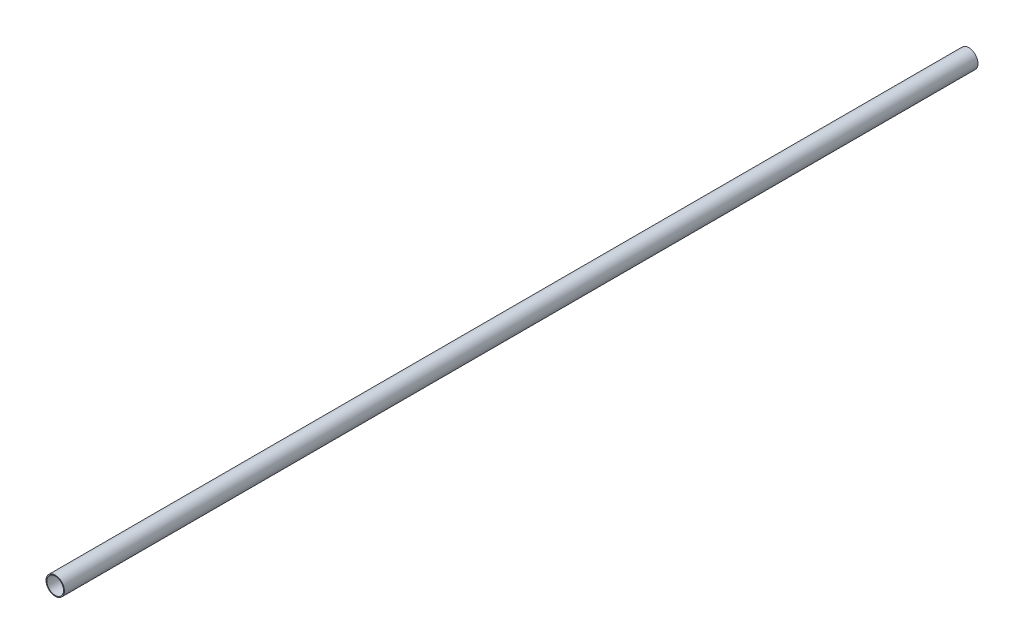
ISO-10303-21;
HEADER;
FILE_DESCRIPTION(('STEP AP214'),'2;1');
FILE_NAME('part.step','',(''),(''),'','','');
FILE_SCHEMA(('AUTOMOTIVE_DESIGN { 1 0 10303 214 1 1 1 1 }'));
ENDSEC;
DATA;
#1=APPLICATION_CONTEXT('core data for automotive mechanical design processes');
#2=APPLICATION_PROTOCOL_DEFINITION('international standard','automotive_design',2000,#1);
#3=PRODUCT_CONTEXT('',#1,'mechanical');
#4=PRODUCT('Part','Part','',(#3));
#5=PRODUCT_RELATED_PRODUCT_CATEGORY('part','',(#4));
#6=PRODUCT_DEFINITION_FORMATION('','',#4);
#7=PRODUCT_DEFINITION_CONTEXT('part definition',#1,'design');
#8=PRODUCT_DEFINITION('design','',#6,#7);
#9=PRODUCT_DEFINITION_SHAPE('','',#8);
#10=(LENGTH_UNIT() NAMED_UNIT(*) SI_UNIT(.MILLI.,.METRE.));
#11=(NAMED_UNIT(*) PLANE_ANGLE_UNIT() SI_UNIT($,.RADIAN.));
#12=(NAMED_UNIT(*) SI_UNIT($,.STERADIAN.) SOLID_ANGLE_UNIT());
#13=UNCERTAINTY_MEASURE_WITH_UNIT(LENGTH_MEASURE(1.E-05),#10,'distance_accuracy_value','');
#14=(GEOMETRIC_REPRESENTATION_CONTEXT(3) GLOBAL_UNCERTAINTY_ASSIGNED_CONTEXT((#13)) GLOBAL_UNIT_ASSIGNED_CONTEXT((#10,
#11,#12)) REPRESENTATION_CONTEXT('',''));
#15=CARTESIAN_POINT('',(0.,0.,0.));
#16=DIRECTION('',(0.,0.,1.));
#17=DIRECTION('',(1.,0.,0.));
#18=AXIS2_PLACEMENT_3D('',#15,#16,#17);
#19=CARTESIAN_POINT('',(0.,0.,1085.85));
#20=DIRECTION('',(0.,0.,1.));
#21=DIRECTION('',(1.,0.,0.));
#22=AXIS2_PLACEMENT_3D('',#19,#20,#21);
#23=PLANE('',#22);
#24=CARTESIAN_POINT('',(0.,0.,1085.85));
#25=DIRECTION('',(0.,0.,1.));
#26=DIRECTION('',(1.,0.,0.));
#27=AXIS2_PLACEMENT_3D('',#24,#25,#26);
#28=CIRCLE('',#27,10.9601);
#29=CARTESIAN_POINT('',(10.9601,0.,1085.85));
#30=VERTEX_POINT('',#29);
#31=EDGE_CURVE('E10',#30,#30,#28,.T.);
#32=ORIENTED_EDGE('',*,*,#31,.T.);
#33=EDGE_LOOP('',(#32));
#34=FACE_BOUND('',#33,.T.);
#35=CARTESIAN_POINT('',(0.,0.,1085.85));
#36=DIRECTION('',(0.,0.,1.));
#37=DIRECTION('',(1.,0.,0.));
#38=AXIS2_PLACEMENT_3D('',#35,#36,#37);
#39=CIRCLE('',#38,9.9441);
#40=CARTESIAN_POINT('',(9.9441,0.,1085.85));
#41=VERTEX_POINT('',#40);
#42=EDGE_CURVE('E48',#41,#41,#39,.T.);
#43=ORIENTED_EDGE('',*,*,#42,.F.);
#44=EDGE_LOOP('',(#43));
#45=FACE_BOUND('',#44,.T.);
#46=ADVANCED_FACE('F37',(#34,#45),#23,.T.);
#47=CARTESIAN_POINT('',(0.,0.,0.));
#48=DIRECTION('',(0.,0.,1.));
#49=DIRECTION('',(1.,0.,0.));
#50=AXIS2_PLACEMENT_3D('',#47,#48,#49);
#51=PLANE('',#50);
#52=CARTESIAN_POINT('',(0.,0.,0.));
#53=DIRECTION('',(0.,0.,1.));
#54=DIRECTION('',(1.,0.,0.));
#55=AXIS2_PLACEMENT_3D('',#52,#53,#54);
#56=CIRCLE('',#55,10.9601);
#57=CARTESIAN_POINT('',(10.9601,0.,0.));
#58=VERTEX_POINT('',#57);
#59=EDGE_CURVE('E41',#58,#58,#56,.T.);
#60=ORIENTED_EDGE('',*,*,#59,.F.);
#61=EDGE_LOOP('',(#60));
#62=FACE_BOUND('',#61,.T.);
#63=CARTESIAN_POINT('',(0.,0.,0.));
#64=DIRECTION('',(0.,0.,1.));
#65=DIRECTION('',(1.,0.,0.));
#66=AXIS2_PLACEMENT_3D('',#63,#64,#65);
#67=CIRCLE('',#66,9.9441);
#68=CARTESIAN_POINT('',(9.9441,0.,0.));
#69=VERTEX_POINT('',#68);
#70=EDGE_CURVE('E50',#69,#69,#67,.T.);
#71=ORIENTED_EDGE('',*,*,#70,.T.);
#72=EDGE_LOOP('',(#71));
#73=FACE_BOUND('',#72,.T.);
#74=ADVANCED_FACE('F60',(#62,#73),#51,.F.);
#75=CARTESIAN_POINT('',(0.,0.,1085.85));
#76=DIRECTION('',(0.,0.,-1.));
#77=DIRECTION('',(-1.,0.,0.));
#78=AXIS2_PLACEMENT_3D('',#75,#76,#77);
#79=CYLINDRICAL_SURFACE('',#78,10.9601);
#80=ORIENTED_EDGE('',*,*,#31,.F.);
#81=EDGE_LOOP('',(#80));
#82=FACE_BOUND('',#81,.T.);
#83=ORIENTED_EDGE('',*,*,#59,.T.);
#84=EDGE_LOOP('',(#83));
#85=FACE_BOUND('',#84,.T.);
#86=ADVANCED_FACE('F39',(#82,#85),#79,.T.);
#87=CARTESIAN_POINT('',(0.,0.,1085.85));
#88=DIRECTION('',(0.,0.,-1.));
#89=DIRECTION('',(-1.,0.,0.));
#90=AXIS2_PLACEMENT_3D('',#87,#88,#89);
#91=CYLINDRICAL_SURFACE('',#90,9.9441);
#92=ORIENTED_EDGE('',*,*,#42,.T.);
#93=EDGE_LOOP('',(#92));
#94=FACE_BOUND('',#93,.T.);
#95=ORIENTED_EDGE('',*,*,#70,.F.);
#96=EDGE_LOOP('',(#95));
#97=FACE_BOUND('',#96,.T.);
#98=ADVANCED_FACE('F56',(#94,#97),#91,.F.);
#99=CLOSED_SHELL('',(#46,#74,#86,#98));
#100=MANIFOLD_SOLID_BREP('B2',#99);
#101=ADVANCED_BREP_SHAPE_REPRESENTATION('',(#18,#100),#14);
#102=SHAPE_DEFINITION_REPRESENTATION(#9,#101);
ENDSEC;
END-ISO-10303-21;
